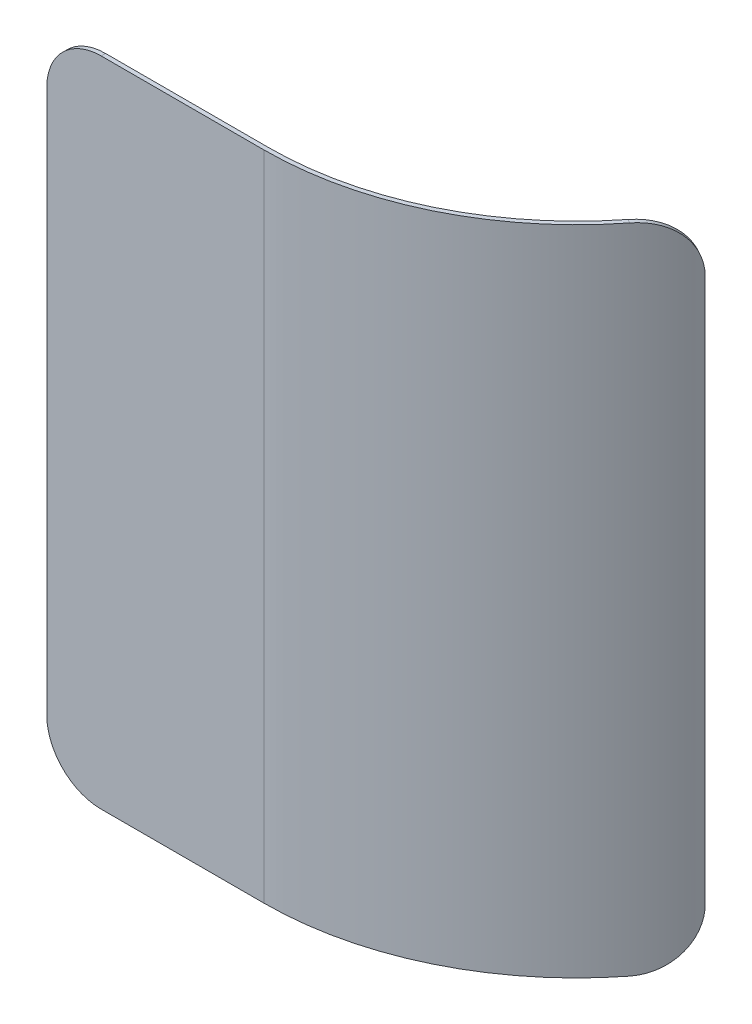
ISO-10303-21;
HEADER;
FILE_DESCRIPTION(('STEP AP214'),'2;1');
FILE_NAME('part.step','',(''),(''),'','','');
FILE_SCHEMA(('AUTOMOTIVE_DESIGN { 1 0 10303 214 1 1 1 1 }'));
ENDSEC;
DATA;
#1=APPLICATION_CONTEXT('core data for automotive mechanical design processes');
#2=APPLICATION_PROTOCOL_DEFINITION('international standard','automotive_design',2000,#1);
#3=PRODUCT_CONTEXT('',#1,'mechanical');
#4=PRODUCT('Part','Part','',(#3));
#5=PRODUCT_RELATED_PRODUCT_CATEGORY('part','',(#4));
#6=PRODUCT_DEFINITION_FORMATION('','',#4);
#7=PRODUCT_DEFINITION_CONTEXT('part definition',#1,'design');
#8=PRODUCT_DEFINITION('design','',#6,#7);
#9=PRODUCT_DEFINITION_SHAPE('','',#8);
#10=(LENGTH_UNIT() NAMED_UNIT(*) SI_UNIT(.MILLI.,.METRE.));
#11=(NAMED_UNIT(*) PLANE_ANGLE_UNIT() SI_UNIT($,.RADIAN.));
#12=(NAMED_UNIT(*) SI_UNIT($,.STERADIAN.) SOLID_ANGLE_UNIT());
#13=UNCERTAINTY_MEASURE_WITH_UNIT(LENGTH_MEASURE(1.E-05),#10,'distance_accuracy_value','');
#14=(GEOMETRIC_REPRESENTATION_CONTEXT(3) GLOBAL_UNCERTAINTY_ASSIGNED_CONTEXT((#13)) GLOBAL_UNIT_ASSIGNED_CONTEXT((#10,
#11,#12)) REPRESENTATION_CONTEXT('',''));
#15=CARTESIAN_POINT('',(0.,0.,0.));
#16=DIRECTION('',(0.,0.,1.));
#17=DIRECTION('',(1.,0.,0.));
#18=AXIS2_PLACEMENT_3D('',#15,#16,#17);
#19=CARTESIAN_POINT('',(50.8,152.4,-71.9582));
#20=DIRECTION('',(0.,-1.,0.));
#21=DIRECTION('',(0.,0.,-1.));
#22=AXIS2_PLACEMENT_3D('',#19,#20,#21);
#23=CYLINDRICAL_SURFACE('',#22,72.9742);
#24=CARTESIAN_POINT('',(50.8,0.,-71.9582));
#25=DIRECTION('',(0.,1.,0.));
#26=DIRECTION('',(1.,0.,0.));
#27=AXIS2_PLACEMENT_3D('',#24,#25,#26);
#28=CIRCLE('',#27,72.9742);
#29=CARTESIAN_POINT('',(50.8,0.,1.016));
#30=VERTEX_POINT('',#29);
#31=CARTESIAN_POINT('',(108.233107341025,0.,-26.9396255357376));
#32=VERTEX_POINT('',#31);
#33=EDGE_CURVE('E146',#30,#32,#28,.T.);
#34=ORIENTED_EDGE('',*,*,#33,.T.);
#35=CARTESIAN_POINT('',(108.233107341025,0.,-26.9396255357376));
#36=CARTESIAN_POINT('',(108.453169759597,-3.95875631742819E-05,-27.2203318838978));
#37=CARTESIAN_POINT('',(108.671142066505,0.0145697167028511,-27.5026923929409));
#38=CARTESIAN_POINT('',(109.101514288191,0.0730377901516772,-28.0686490131688));
#39=CARTESIAN_POINT('',(109.313913928218,0.116897998704514,-28.3522451844756));
#40=CARTESIAN_POINT('',(109.731615060299,0.23378831130764,-28.9184210318365));
#41=CARTESIAN_POINT('',(109.936920285346,0.30680281273591,-29.201001170157));
#42=CARTESIAN_POINT('',(110.339278239954,0.481653975923577,-29.763086523747));
#43=CARTESIAN_POINT('',(110.536331325616,0.583489392507133,-30.0425918713176));
#44=CARTESIAN_POINT('',(110.921238852588,0.815528483083022,-30.5965703400363));
#45=CARTESIAN_POINT('',(111.109083984098,0.945760171245922,-30.8710381995055));
#46=CARTESIAN_POINT('',(111.474353462717,1.23371344440364,-31.4123823980533));
#47=CARTESIAN_POINT('',(111.651777850124,1.39143492308311,-31.6792587664869));
#48=CARTESIAN_POINT('',(111.995280233168,1.73325989000364,-32.2030792613));
#49=CARTESIAN_POINT('',(112.161361870878,1.91735485053993,-32.4600265642142));
#50=CARTESIAN_POINT('',(112.48151115482,2.31068958298728,-32.9618713344081));
#51=CARTESIAN_POINT('',(112.635578954513,2.51992903362033,-33.2067689555935));
#52=CARTESIAN_POINT('',(112.929945244663,2.96033450437034,-33.6805178656449));
#53=CARTESIAN_POINT('',(113.070342581162,3.19131494925111,-33.9094802968036));
#54=CARTESIAN_POINT('',(113.338273330667,3.6749516889415,-34.3514846259011));
#55=CARTESIAN_POINT('',(113.465806740467,3.92760798915302,-34.5645265198723));
#56=CARTESIAN_POINT('',(113.707690811347,4.4528818789554,-34.9728967779243));
#57=CARTESIAN_POINT('',(113.822038113978,4.7255045251132,-35.1682206265979));
#58=CARTESIAN_POINT('',(114.037254804848,5.28872802436848,-35.5393929184948));
#59=CARTESIAN_POINT('',(114.138124322406,5.57932870492994,-35.7152415485774));
#60=CARTESIAN_POINT('',(114.326535354242,6.17750978729588,-36.0465079550277));
#61=CARTESIAN_POINT('',(114.414029093693,6.48514594233968,-36.201852237248));
#62=CARTESIAN_POINT('',(114.575143707308,7.11428807054829,-36.4900146602961));
#63=CARTESIAN_POINT('',(114.648764402979,7.43579422210217,-36.6228325112916));
#64=CARTESIAN_POINT('',(114.782029940982,8.09028722573862,-36.8647134590453));
#65=CARTESIAN_POINT('',(114.841680555302,8.4232692708858,-36.9737863651332));
#66=CARTESIAN_POINT('',(114.946986202533,9.09834933981883,-37.1672513825819));
#67=CARTESIAN_POINT('',(114.992644248992,9.44044538346856,-37.2516488080647));
#68=CARTESIAN_POINT('',(115.084699178187,10.2632807429788,-37.422359361239));
#69=CARTESIAN_POINT('',(115.124758535671,10.7472154722341,-37.4971671818313));
#70=CARTESIAN_POINT('',(115.164772964845,11.4773956666169,-37.5720032268193));
#71=CARTESIAN_POINT('',(115.174765352432,11.7213823527958,-37.5907192628038));
#72=CARTESIAN_POINT('',(115.188089502668,12.2102234694188,-37.6156911279975));
#73=CARTESIAN_POINT('',(115.191419918982,12.4550780652469,-37.6219444385843));
#74=CARTESIAN_POINT('',(115.191424135602,12.7,-37.6219456406636));
#75=B_SPLINE_CURVE_WITH_KNOTS('',3,(#35,#36,#37,#38,#39,#40,#41,#42,#43,#44,#45,#46,#47,#48,#49,
#50,#51,#52,#53,#54,#55,#56,#57,#58,#59,#60,#61,#62,#63,#64,#65,#66,#67,#68,#69,#70,#71,#72,#73,
#74),.UNSPECIFIED.,.F.,.F.,(4,2,2,2,2,2,2,2,2,2,2,2,2,2,2,2,2,2,2,4),(0.,1.06976160584045,
2.13957585608495,3.20881833519534,4.27801462591431,5.34827053715569,6.41852230932959,
7.48842879992278,8.55832162148128,9.6197921173392,10.6812628777306,11.7430033961913,
12.8047337266604,13.8701718790906,14.9356237387498,16.0006346083193,17.0654159474623,
18.5356054122993,19.2699859955488,20.0045149765091),.UNSPECIFIED.);
#76=CARTESIAN_POINT('',(115.191424135602,12.7,-37.6219456406636));
#77=VERTEX_POINT('',#76);
#78=EDGE_CURVE('E190',#32,#77,#75,.T.);
#79=ORIENTED_EDGE('',*,*,#78,.T.);
#80=DIRECTION('',(0.,-1.,0.));
#81=VECTOR('',#80,1.);
#82=CARTESIAN_POINT('',(115.191424135602,152.4,-37.6219456406636));
#83=LINE('',#82,#81);
#84=CARTESIAN_POINT('',(115.191424135602,139.7,-37.6219456406636));
#85=VERTEX_POINT('',#84);
#86=EDGE_CURVE('E161',#85,#77,#83,.T.);
#87=ORIENTED_EDGE('',*,*,#86,.F.);
#88=CARTESIAN_POINT('',(115.191424135602,139.7,-37.6219456406636));
#89=CARTESIAN_POINT('',(115.191424772239,140.057093889125,-37.6219887781376));
#90=CARTESIAN_POINT('',(115.184337778062,140.414182276718,-37.6086577782013));
#91=CARTESIAN_POINT('',(115.155993029288,141.12580613468,-37.5555590827894));
#92=CARTESIAN_POINT('',(115.134735936347,141.480341723467,-37.5157926216876));
#93=CARTESIAN_POINT('',(115.078075413901,142.184104425506,-37.4101716683627));
#94=CARTESIAN_POINT('',(115.042681939858,142.533335095431,-37.3443355358289));
#95=CARTESIAN_POINT('',(114.957761569478,143.22425942651,-37.1871844887364));
#96=CARTESIAN_POINT('',(114.908234845996,143.565953179789,-37.0958698857888));
#97=CARTESIAN_POINT('',(114.795045874634,144.23955056805,-36.8885279181646));
#98=CARTESIAN_POINT('',(114.731376483929,144.571449159636,-36.772488067086));
#99=CARTESIAN_POINT('',(114.58996777691,145.222911844635,-36.5167664235994));
#100=CARTESIAN_POINT('',(114.512228484411,145.542475958923,-36.3770846712074));
#101=CARTESIAN_POINT('',(114.342781341037,146.166939624257,-36.0753528239628));
#102=CARTESIAN_POINT('',(114.251075786002,146.471841574718,-35.9133064059298));
#103=CARTESIAN_POINT('',(114.053825615632,147.064856195397,-35.5682716962739));
#104=CARTESIAN_POINT('',(113.948281094115,147.352968979412,-35.385283546621));
#105=CARTESIAN_POINT('',(113.723700455362,147.909989491082,-35.0002322558067));
#106=CARTESIAN_POINT('',(113.604681642185,148.178921143789,-34.7981936343159));
#107=CARTESIAN_POINT('',(113.353331332349,148.696058774559,-34.3766245946388));
#108=CARTESIAN_POINT('',(113.220999780899,148.944264667315,-34.1570941044631));
#109=CARTESIAN_POINT('',(112.94340102046,149.418194824555,-33.7024487715776));
#110=CARTESIAN_POINT('',(112.798132758812,149.64391725639,-33.4673326610657));
#111=CARTESIAN_POINT('',(112.49517619262,150.071249311005,-32.9835861023984));
#112=CARTESIAN_POINT('',(112.337488121573,150.272859386929,-32.7349559083412));
#113=CARTESIAN_POINT('',(112.011159926929,150.649588965819,-32.2276293172417));
#114=CARTESIAN_POINT('',(111.842580030043,150.824838851398,-31.9689909954213));
#115=CARTESIAN_POINT('',(111.494509110154,151.148890731984,-31.4426477153245));
#116=CARTESIAN_POINT('',(111.315017996357,151.297692506876,-31.1749426816119));
#117=CARTESIAN_POINT('',(110.946062467839,151.56784242961,-30.6327542241648));
#118=CARTESIAN_POINT('',(110.756600864727,151.689198266422,-30.3582727228157));
#119=CARTESIAN_POINT('',(110.368776240245,151.903747029049,-29.8048008332721));
#120=CARTESIAN_POINT('',(110.170415155616,151.996946048647,-29.5258114344796));
#121=CARTESIAN_POINT('',(109.691115589984,152.183843736351,-28.8618697276416));
#122=CARTESIAN_POINT('',(109.406707694697,152.265044621365,-28.4757929948779));
#123=CARTESIAN_POINT('',(108.972019604202,152.346090954016,-27.8979199561549));
#124=CARTESIAN_POINT('',(108.825869689256,152.36631396329,-27.7056202440967));
#125=CARTESIAN_POINT('',(108.531180144651,152.393268178073,-27.3218553821782));
#126=CARTESIAN_POINT('',(108.38264011356,152.399997092823,-27.1303903795224));
#127=CARTESIAN_POINT('',(108.233107341025,152.4,-26.9396255357376));
#128=B_SPLINE_CURVE_WITH_KNOTS('',3,(#88,#89,#90,#91,#92,#93,#94,#95,#96,#97,#98,#99,#100,#101,
#102,#103,#104,#105,#106,#107,#108,#109,#110,#111,#112,#113,#114,#115,#116,#117,#118,#119,#120,
#121,#122,#123,#124,#125,#126,#127),.UNSPECIFIED.,.F.,.F.,(4,2,2,2,2,2,2,2,2,2,2,2,2,2,2,2,2,2,
2,4),(0.,1.07095489029427,2.14185977708419,3.21201181157579,4.28215075828529,5.35283141803801,
6.42351026558771,7.49401329946163,8.56450907651355,9.63364536283926,10.7027860495244,
11.7720138117424,12.8412214767912,13.9049532242588,14.9686938242975,16.032136047588,
17.0953479523486,18.550761733781,19.2775771530068,20.0045159461018),.UNSPECIFIED.);
#129=CARTESIAN_POINT('',(108.233107341025,152.4,-26.9396255357376));
#130=VERTEX_POINT('',#129);
#131=EDGE_CURVE('E184',#85,#130,#128,.T.);
#132=ORIENTED_EDGE('',*,*,#131,.T.);
#133=CARTESIAN_POINT('',(50.8,152.4,-71.9582));
#134=DIRECTION('',(0.,1.,0.));
#135=DIRECTION('',(1.,0.,0.));
#136=AXIS2_PLACEMENT_3D('',#133,#134,#135);
#137=CIRCLE('',#136,72.9742);
#138=CARTESIAN_POINT('',(50.8,152.4,1.016));
#139=VERTEX_POINT('',#138);
#140=EDGE_CURVE('E139',#139,#130,#137,.T.);
#141=ORIENTED_EDGE('',*,*,#140,.F.);
#142=DIRECTION('',(0.,-1.,0.));
#143=VECTOR('',#142,1.);
#144=CARTESIAN_POINT('',(50.8,152.4,1.016));
#145=LINE('',#144,#143);
#146=EDGE_CURVE('E145',#139,#30,#145,.T.);
#147=ORIENTED_EDGE('',*,*,#146,.T.);
#148=EDGE_LOOP('',(#34,#79,#87,#132,#141,#147));
#149=FACE_BOUND('',#148,.T.);
#150=ADVANCED_FACE('F33',(#149),#23,.T.);
#151=CARTESIAN_POINT('',(114.294919796784,152.4,-38.1));
#152=DIRECTION('',(0.470525944228745,0.,-0.882386160253915));
#153=DIRECTION('',(-0.882386160253915,0.,-0.470525944228745));
#154=AXIS2_PLACEMENT_3D('',#151,#152,#153);
#155=PLANE('',#154);
#156=ORIENTED_EDGE('',*,*,#86,.T.);
#157=DIRECTION('',(0.882386160253915,0.,0.470525944228745));
#158=VECTOR('',#157,1.);
#159=CARTESIAN_POINT('',(114.294919796784,12.7,-38.1));
#160=LINE('',#159,#158);
#161=CARTESIAN_POINT('',(114.294919796784,12.7,-38.1));
#162=VERTEX_POINT('',#161);
#163=EDGE_CURVE('E53',#77,#162,#160,.F.);
#164=ORIENTED_EDGE('',*,*,#163,.T.);
#165=DIRECTION('',(0.,-1.,0.));
#166=VECTOR('',#165,1.);
#167=CARTESIAN_POINT('',(114.294919796784,152.4,-38.1));
#168=LINE('',#167,#166);
#169=CARTESIAN_POINT('',(114.294919796784,139.7,-38.1));
#170=VERTEX_POINT('',#169);
#171=EDGE_CURVE('E132',#170,#162,#168,.T.);
#172=ORIENTED_EDGE('',*,*,#171,.F.);
#173=DIRECTION('',(0.882386160253915,0.,0.470525944228745));
#174=VECTOR('',#173,1.);
#175=CARTESIAN_POINT('',(114.294919796784,139.7,-38.1));
#176=LINE('',#175,#174);
#177=EDGE_CURVE('E240',#170,#85,#176,.T.);
#178=ORIENTED_EDGE('',*,*,#177,.T.);
#179=EDGE_LOOP('',(#156,#164,#172,#178));
#180=FACE_BOUND('',#179,.T.);
#181=ADVANCED_FACE('F199',(#180),#155,.T.);
#182=CARTESIAN_POINT('',(50.8,152.4,-71.9582));
#183=DIRECTION('',(0.,-1.,0.));
#184=DIRECTION('',(0.,0.,-1.));
#185=AXIS2_PLACEMENT_3D('',#182,#183,#184);
#186=CYLINDRICAL_SURFACE('',#185,71.9582);
#187=ORIENTED_EDGE('',*,*,#171,.T.);
#188=CARTESIAN_POINT('',(114.294919796784,12.7,-38.1));
#189=CARTESIAN_POINT('',(114.294920187521,12.3429091558952,-38.1000432671134));
#190=CARTESIAN_POINT('',(114.287833552361,11.9858238128965,-38.0867123682238));
#191=CARTESIAN_POINT('',(114.259488953809,11.2742059664593,-38.0336147537666));
#192=CARTESIAN_POINT('',(114.238231651586,10.9196733446971,-37.9938492715729));
#193=CARTESIAN_POINT('',(114.181568323897,10.2159159188054,-37.8882320102927));
#194=CARTESIAN_POINT('',(114.146172234305,9.86668756567965,-37.8223985504668));
#195=CARTESIAN_POINT('',(114.061240818049,9.17576771861875,-37.6652563990039));
#196=CARTESIAN_POINT('',(114.011705664321,8.83407613255631,-37.5739480189515));
#197=CARTESIAN_POINT('',(113.898489480595,8.16048273383067,-37.3666243934827));
#198=CARTESIAN_POINT('',(113.834801294359,7.82858597026572,-37.2505966503734));
#199=CARTESIAN_POINT('',(113.693339146874,7.17712692393352,-36.9949081780948));
#200=CARTESIAN_POINT('',(113.615565211395,6.8575646186016,-36.8552474921623));
#201=CARTESIAN_POINT('',(113.446026636745,6.2331045979696,-36.5535702212698));
#202=CARTESIAN_POINT('',(113.354264292811,5.92820448765519,-36.391557304305));
#203=CARTESIAN_POINT('',(113.156871669285,5.33519400472444,-36.0466061364312));
#204=CARTESIAN_POINT('',(113.051241484263,5.04708351763544,-35.8636680282166));
#205=CARTESIAN_POINT('',(112.826457893722,4.49007844571884,-35.4787447145723));
#206=CARTESIAN_POINT('',(112.707322325692,4.22115926169094,-35.276784691013));
#207=CARTESIAN_POINT('',(112.455697079381,3.7040463655656,-34.8554000291403));
#208=CARTESIAN_POINT('',(112.323207346596,3.45585273806418,-34.6359753195479));
#209=CARTESIAN_POINT('',(112.045245073773,2.98194789016956,-34.1815746274543));
#210=CARTESIAN_POINT('',(111.899771520842,2.75623842672199,-33.9465974320432));
#211=CARTESIAN_POINT('',(111.596351544319,2.32893204104285,-33.4631664463393));
#212=CARTESIAN_POINT('',(111.438405356455,2.12733466328455,-33.2147129107711));
#213=CARTESIAN_POINT('',(111.111533465446,1.75066184029125,-32.7078252107724));
#214=CARTESIAN_POINT('',(110.942670295806,1.57545167408101,-32.4494508284014));
#215=CARTESIAN_POINT('',(110.593969865219,1.25146077682797,-31.9236745605719));
#216=CARTESIAN_POINT('',(110.414132046838,1.10268138978061,-31.6562722168672));
#217=CARTESIAN_POINT('',(110.04442785896,0.832566450858849,-31.114746361113));
#218=CARTESIAN_POINT('',(109.854564477337,0.711222778748387,-30.8406248644469));
#219=CARTESIAN_POINT('',(109.465878047488,0.496681873371202,-30.2879281973359));
#220=CARTESIAN_POINT('',(109.267056942684,0.403478568381806,-30.0093540013083));
#221=CARTESIAN_POINT('',(108.786273807543,0.216419773868907,-29.346014690535));
#222=CARTESIAN_POINT('',(108.500799252649,0.135115588410234,-28.9601441745919));
#223=CARTESIAN_POINT('',(108.064418394771,0.0539704704062548,-28.3826641555148));
#224=CARTESIAN_POINT('',(107.917689304692,0.0337238907779265,-28.1905094874496));
#225=CARTESIAN_POINT('',(107.621812266881,0.00673898099368487,-27.8070633445955));
#226=CARTESIAN_POINT('',(107.472663915984,2.92614513557131E-06,-27.6157720206137));
#227=CARTESIAN_POINT('',(107.322509165148,0.,-27.4251953302525));
#228=B_SPLINE_CURVE_WITH_KNOTS('',3,(#188,#189,#190,#191,#192,#193,#194,#195,#196,#197,#198,
#199,#200,#201,#202,#203,#204,#205,#206,#207,#208,#209,#210,#211,#212,#213,#214,#215,#216,#217,
#218,#219,#220,#221,#222,#223,#224,#225,#226,#227),.UNSPECIFIED.,.F.,.F.,(4,2,2,2,2,2,2,2,2,2,2,
2,2,2,2,2,2,2,2,4),(0.,1.07094576404323,2.14184156384826,3.21198612391585,4.28211759558143,
5.3527913970895,6.42346323981299,7.49395959408999,8.56444864880469,9.63353995537408,
10.702635625467,11.7718147708427,12.8409737140408,13.9044741115231,14.9680285721418,
16.0312678358847,17.0942775249749,18.5511151716778,19.2786401127119,20.0062875659309),.UNSPECIFIED.);
#229=CARTESIAN_POINT('',(107.322509165148,0.,-27.4251953302525));
#230=VERTEX_POINT('',#229);
#231=EDGE_CURVE('E11',#162,#230,#228,.T.);
#232=ORIENTED_EDGE('',*,*,#231,.T.);
#233=CARTESIAN_POINT('',(50.8,0.,-71.9582));
#234=DIRECTION('',(0.,1.,0.));
#235=DIRECTION('',(0.,0.,1.));
#236=AXIS2_PLACEMENT_3D('',#233,#234,#235);
#237=CIRCLE('',#236,71.9582);
#238=CARTESIAN_POINT('',(50.8,0.,0.));
#239=VERTEX_POINT('',#238);
#240=EDGE_CURVE('E131',#239,#230,#237,.T.);
#241=ORIENTED_EDGE('',*,*,#240,.F.);
#242=DIRECTION('',(0.,-1.,0.));
#243=VECTOR('',#242,1.);
#244=CARTESIAN_POINT('',(50.8,152.4,0.));
#245=LINE('',#244,#243);
#246=CARTESIAN_POINT('',(50.8,152.4,0.));
#247=VERTEX_POINT('',#246);
#248=EDGE_CURVE('E119',#247,#239,#245,.T.);
#249=ORIENTED_EDGE('',*,*,#248,.F.);
#250=CARTESIAN_POINT('',(50.8,152.4,-71.9582));
#251=DIRECTION('',(0.,1.,0.));
#252=DIRECTION('',(0.,0.,1.));
#253=AXIS2_PLACEMENT_3D('',#250,#251,#252);
#254=CIRCLE('',#253,71.9582);
#255=CARTESIAN_POINT('',(107.322509165148,152.4,-27.4251953302525));
#256=VERTEX_POINT('',#255);
#257=EDGE_CURVE('E127',#247,#256,#254,.T.);
#258=ORIENTED_EDGE('',*,*,#257,.T.);
#259=CARTESIAN_POINT('',(107.322509165148,152.4,-27.4251953302525));
#260=CARTESIAN_POINT('',(107.543262762416,152.400039614938,-27.7053399146062));
#261=CARTESIAN_POINT('',(107.761901331591,152.385444412754,-27.9871673836646));
#262=CARTESIAN_POINT('',(108.193553871464,152.327026286918,-28.5521185980696));
#263=CARTESIAN_POINT('',(108.406567549585,152.283201846017,-28.8352424099499));
#264=CARTESIAN_POINT('',(108.825441934561,152.166398006581,-29.4005380114797));
#265=CARTESIAN_POINT('',(109.031306359022,152.093434015017,-29.6827102248876));
#266=CARTESIAN_POINT('',(109.434724423152,151.9186932548,-30.2440413761041));
#267=CARTESIAN_POINT('',(109.632278428573,151.816917755706,-30.5232004461221));
#268=CARTESIAN_POINT('',(110.018131710136,151.585001583327,-31.0765496268037));
#269=CARTESIAN_POINT('',(110.206421484079,151.45483250099,-31.3507344607532));
#270=CARTESIAN_POINT('',(110.572520585536,151.167004761433,-31.8915683572262));
#271=CARTESIAN_POINT('',(110.750329954851,151.009346213869,-32.1582174498044));
#272=CARTESIAN_POINT('',(111.09454326441,150.667645685803,-32.6816332233407));
#273=CARTESIAN_POINT('',(111.260950913894,150.483612346443,-32.9384031061983));
#274=CARTESIAN_POINT('',(111.581697041413,150.09039748346,-33.4399384595928));
#275=CARTESIAN_POINT('',(111.736035676112,149.881216286369,-33.6847040859397));
#276=CARTESIAN_POINT('',(112.030858062269,149.440971637625,-34.158177078232));
#277=CARTESIAN_POINT('',(112.171443832906,149.210098980332,-34.3869983726408));
#278=CARTESIAN_POINT('',(112.439712386291,148.726682834288,-34.8287615057544));
#279=CARTESIAN_POINT('',(112.56739516769,148.474139343271,-35.0417033427985));
#280=CARTESIAN_POINT('',(112.809545346752,147.949094492449,-35.4499107470819));
#281=CARTESIAN_POINT('',(112.924009357783,147.676588047258,-35.6451717817684));
#282=CARTESIAN_POINT('',(113.139433172202,147.113599390059,-36.0162514861935));
#283=CARTESIAN_POINT('',(113.240393103,146.823117347688,-36.1920703393664));
#284=CARTESIAN_POINT('',(113.42897394222,146.225148561519,-36.5233211252008));
#285=CARTESIAN_POINT('',(113.516545790539,145.9176046506,-36.6786778001433));
#286=CARTESIAN_POINT('',(113.677800853105,145.288644255124,-36.9668869967502));
#287=CARTESIAN_POINT('',(113.75148388667,144.967227590162,-37.0997392256491));
#288=CARTESIAN_POINT('',(113.884864333826,144.312909072566,-37.3417076172491));
#289=CARTESIAN_POINT('',(113.944567500894,143.980012009686,-37.4508335432896));
#290=CARTESIAN_POINT('',(114.04997346988,143.305096744067,-37.644419984306));
#291=CARTESIAN_POINT('',(114.095679276381,142.963080515948,-37.7288857924794));
#292=CARTESIAN_POINT('',(114.187922546489,142.139754882538,-37.8999137968078));
#293=CARTESIAN_POINT('',(114.228084681346,141.655227868426,-37.9749082770272));
#294=CARTESIAN_POINT('',(114.268201180097,140.924141466747,-38.0499318159391));
#295=CARTESIAN_POINT('',(114.278218908432,140.679849254816,-38.0686949337954));
#296=CARTESIAN_POINT('',(114.29157674988,140.190394017185,-38.093729688974));
#297=CARTESIAN_POINT('',(114.294915515689,139.945230825778,-38.0999988059607));
#298=CARTESIAN_POINT('',(114.294919796784,139.7,-38.1));
#299=B_SPLINE_CURVE_WITH_KNOTS('',3,(#259,#260,#261,#262,#263,#264,#265,#266,#267,#268,#269,
#270,#271,#272,#273,#274,#275,#276,#277,#278,#279,#280,#281,#282,#283,#284,#285,#286,#287,#288,
#289,#290,#291,#292,#293,#294,#295,#296,#297,#298),.UNSPECIFIED.,.F.,.F.,(4,2,2,2,2,2,2,2,2,2,2,
2,2,2,2,2,2,2,2,4),(0.,1.06971893764533,2.13949340724581,3.20870300165983,4.27786548945213,
5.34810266966203,6.41833558085205,7.48821865117481,8.55808783121327,9.61929853430191,
10.6805093483694,11.7419914429135,12.803463521665,13.868736610944,14.9340235575355,
15.9988713069259,17.0634903225969,18.5355254424069,19.2708318057827,20.0062864828454),.UNSPECIFIED.);
#300=EDGE_CURVE('E46',#256,#170,#299,.T.);
#301=ORIENTED_EDGE('',*,*,#300,.T.);
#302=EDGE_LOOP('',(#187,#232,#241,#249,#258,#301));
#303=FACE_BOUND('',#302,.T.);
#304=ADVANCED_FACE('F129',(#303),#186,.F.);
#305=CARTESIAN_POINT('',(0.,152.4,0.));
#306=DIRECTION('',(0.,0.,-1.));
#307=DIRECTION('',(-1.,0.,0.));
#308=AXIS2_PLACEMENT_3D('',#305,#306,#307);
#309=PLANE('',#308);
#310=DIRECTION('',(1.,0.,0.));
#311=VECTOR('',#310,1.);
#312=CARTESIAN_POINT('',(0.,0.,0.));
#313=LINE('',#312,#311);
#314=CARTESIAN_POINT('',(12.7,0.,0.));
#315=VERTEX_POINT('',#314);
#316=EDGE_CURVE('E150',#315,#239,#313,.T.);
#317=ORIENTED_EDGE('',*,*,#316,.F.);
#318=CARTESIAN_POINT('',(12.7,12.7,0.));
#319=DIRECTION('',(0.,0.,-1.));
#320=DIRECTION('',(-1.,0.,0.));
#321=AXIS2_PLACEMENT_3D('',#318,#319,#320);
#322=CIRCLE('',#321,12.7);
#323=CARTESIAN_POINT('',(0.,12.7,0.));
#324=VERTEX_POINT('',#323);
#325=EDGE_CURVE('E170',#315,#324,#322,.T.);
#326=ORIENTED_EDGE('',*,*,#325,.T.);
#327=DIRECTION('',(0.,-1.,0.));
#328=VECTOR('',#327,1.);
#329=CARTESIAN_POINT('',(0.,152.4,0.));
#330=LINE('',#329,#328);
#331=CARTESIAN_POINT('',(0.,139.7,0.));
#332=VERTEX_POINT('',#331);
#333=EDGE_CURVE('E133',#332,#324,#330,.T.);
#334=ORIENTED_EDGE('',*,*,#333,.F.);
#335=CARTESIAN_POINT('',(12.7,139.7,0.));
#336=DIRECTION('',(0.,0.,-1.));
#337=DIRECTION('',(-1.,0.,0.));
#338=AXIS2_PLACEMENT_3D('',#335,#336,#337);
#339=CIRCLE('',#338,12.7);
#340=CARTESIAN_POINT('',(12.7,152.4,0.));
#341=VERTEX_POINT('',#340);
#342=EDGE_CURVE('E122',#332,#341,#339,.T.);
#343=ORIENTED_EDGE('',*,*,#342,.T.);
#344=DIRECTION('',(1.,0.,0.));
#345=VECTOR('',#344,1.);
#346=CARTESIAN_POINT('',(0.,152.4,0.));
#347=LINE('',#346,#345);
#348=EDGE_CURVE('E115',#341,#247,#347,.T.);
#349=ORIENTED_EDGE('',*,*,#348,.T.);
#350=ORIENTED_EDGE('',*,*,#248,.T.);
#351=EDGE_LOOP('',(#317,#326,#334,#343,#349,#350));
#352=FACE_BOUND('',#351,.T.);
#353=ADVANCED_FACE('F118',(#352),#309,.T.);
#354=CARTESIAN_POINT('',(0.,152.4,1.016));
#355=DIRECTION('',(-1.,0.,0.));
#356=DIRECTION('',(0.,0.,1.));
#357=AXIS2_PLACEMENT_3D('',#354,#355,#356);
#358=PLANE('',#357);
#359=ORIENTED_EDGE('',*,*,#333,.T.);
#360=DIRECTION('',(0.,0.,-1.));
#361=VECTOR('',#360,1.);
#362=CARTESIAN_POINT('',(0.,12.7,1.016));
#363=LINE('',#362,#361);
#364=CARTESIAN_POINT('',(0.,12.7,1.016));
#365=VERTEX_POINT('',#364);
#366=EDGE_CURVE('E175',#324,#365,#363,.F.);
#367=ORIENTED_EDGE('',*,*,#366,.T.);
#368=DIRECTION('',(0.,-1.,0.));
#369=VECTOR('',#368,1.);
#370=CARTESIAN_POINT('',(0.,152.4,1.016));
#371=LINE('',#370,#369);
#372=CARTESIAN_POINT('',(0.,139.7,1.016));
#373=VERTEX_POINT('',#372);
#374=EDGE_CURVE('E155',#373,#365,#371,.T.);
#375=ORIENTED_EDGE('',*,*,#374,.F.);
#376=DIRECTION('',(0.,0.,-1.));
#377=VECTOR('',#376,1.);
#378=CARTESIAN_POINT('',(0.,139.7,1.016));
#379=LINE('',#378,#377);
#380=EDGE_CURVE('E172',#373,#332,#379,.T.);
#381=ORIENTED_EDGE('',*,*,#380,.T.);
#382=EDGE_LOOP('',(#359,#367,#375,#381));
#383=FACE_BOUND('',#382,.T.);
#384=ADVANCED_FACE('F227',(#383),#358,.T.);
#385=CARTESIAN_POINT('',(0.,152.4,1.016));
#386=DIRECTION('',(0.,0.,-1.));
#387=DIRECTION('',(-1.,0.,0.));
#388=AXIS2_PLACEMENT_3D('',#385,#386,#387);
#389=PLANE('',#388);
#390=ORIENTED_EDGE('',*,*,#374,.T.);
#391=CARTESIAN_POINT('',(12.7,12.7,1.016));
#392=DIRECTION('',(0.,0.,-1.));
#393=DIRECTION('',(-1.,0.,0.));
#394=AXIS2_PLACEMENT_3D('',#391,#392,#393);
#395=CIRCLE('',#394,12.7);
#396=CARTESIAN_POINT('',(12.7,0.,1.016));
#397=VERTEX_POINT('',#396);
#398=EDGE_CURVE('E179',#365,#397,#395,.F.);
#399=ORIENTED_EDGE('',*,*,#398,.T.);
#400=DIRECTION('',(1.,0.,0.));
#401=VECTOR('',#400,1.);
#402=CARTESIAN_POINT('',(0.,0.,1.016));
#403=LINE('',#402,#401);
#404=EDGE_CURVE('E141',#397,#30,#403,.T.);
#405=ORIENTED_EDGE('',*,*,#404,.T.);
#406=ORIENTED_EDGE('',*,*,#146,.F.);
#407=DIRECTION('',(1.,0.,0.));
#408=VECTOR('',#407,1.);
#409=CARTESIAN_POINT('',(0.,152.4,1.016));
#410=LINE('',#409,#408);
#411=CARTESIAN_POINT('',(12.7,152.4,1.016));
#412=VERTEX_POINT('',#411);
#413=EDGE_CURVE('E126',#412,#139,#410,.T.);
#414=ORIENTED_EDGE('',*,*,#413,.F.);
#415=CARTESIAN_POINT('',(12.7,139.7,1.016));
#416=DIRECTION('',(0.,0.,-1.));
#417=DIRECTION('',(-1.,0.,0.));
#418=AXIS2_PLACEMENT_3D('',#415,#416,#417);
#419=CIRCLE('',#418,12.7);
#420=EDGE_CURVE('E177',#412,#373,#419,.F.);
#421=ORIENTED_EDGE('',*,*,#420,.T.);
#422=EDGE_LOOP('',(#390,#399,#405,#406,#414,#421));
#423=FACE_BOUND('',#422,.T.);
#424=ADVANCED_FACE('F232',(#423),#389,.F.);
#425=CARTESIAN_POINT('',(50.8,152.4,-71.9582));
#426=DIRECTION('',(0.,1.,0.));
#427=DIRECTION('',(0.,0.,1.));
#428=AXIS2_PLACEMENT_3D('',#425,#426,#427);
#429=PLANE('',#428);
#430=ORIENTED_EDGE('',*,*,#348,.F.);
#431=DIRECTION('',(0.,0.,-1.));
#432=VECTOR('',#431,1.);
#433=CARTESIAN_POINT('',(12.7,152.4,-71.9582));
#434=LINE('',#433,#432);
#435=EDGE_CURVE('E182',#341,#412,#434,.F.);
#436=ORIENTED_EDGE('',*,*,#435,.T.);
#437=ORIENTED_EDGE('',*,*,#413,.T.);
#438=ORIENTED_EDGE('',*,*,#140,.T.);
#439=DIRECTION('',(0.882386160253915,0.,0.470525944228745));
#440=VECTOR('',#439,1.);
#441=CARTESIAN_POINT('',(44.8243205082954,152.4,-60.7518957647762));
#442=LINE('',#441,#440);
#443=EDGE_CURVE('E138',#130,#256,#442,.F.);
#444=ORIENTED_EDGE('',*,*,#443,.T.);
#445=ORIENTED_EDGE('',*,*,#257,.F.);
#446=EDGE_LOOP('',(#430,#436,#437,#438,#444,#445));
#447=FACE_BOUND('',#446,.T.);
#448=ADVANCED_FACE('F135',(#447),#429,.T.);
#449=CARTESIAN_POINT('',(50.8,0.,-71.9582));
#450=DIRECTION('',(0.,1.,0.));
#451=DIRECTION('',(0.,0.,1.));
#452=AXIS2_PLACEMENT_3D('',#449,#450,#451);
#453=PLANE('',#452);
#454=ORIENTED_EDGE('',*,*,#404,.F.);
#455=DIRECTION('',(0.,0.,-1.));
#456=VECTOR('',#455,1.);
#457=CARTESIAN_POINT('',(12.7,0.,0.));
#458=LINE('',#457,#456);
#459=EDGE_CURVE('E166',#397,#315,#458,.T.);
#460=ORIENTED_EDGE('',*,*,#459,.T.);
#461=ORIENTED_EDGE('',*,*,#316,.T.);
#462=ORIENTED_EDGE('',*,*,#240,.T.);
#463=DIRECTION('',(0.882386160253915,0.,0.470525944228745));
#464=VECTOR('',#463,1.);
#465=CARTESIAN_POINT('',(109.215744643897,0.,-26.4156414054389));
#466=LINE('',#465,#464);
#467=EDGE_CURVE('E163',#230,#32,#466,.T.);
#468=ORIENTED_EDGE('',*,*,#467,.T.);
#469=ORIENTED_EDGE('',*,*,#33,.F.);
#470=EDGE_LOOP('',(#454,#460,#461,#462,#468,#469));
#471=FACE_BOUND('',#470,.T.);
#472=ADVANCED_FACE('F206',(#471),#453,.F.);
#473=CARTESIAN_POINT('',(12.7,12.7,-71.9582));
#474=DIRECTION('',(0.,0.,1.));
#475=DIRECTION('',(1.,0.,0.));
#476=AXIS2_PLACEMENT_3D('',#473,#474,#475);
#477=CYLINDRICAL_SURFACE('',#476,12.7);
#478=ORIENTED_EDGE('',*,*,#398,.F.);
#479=ORIENTED_EDGE('',*,*,#366,.F.);
#480=ORIENTED_EDGE('',*,*,#325,.F.);
#481=ORIENTED_EDGE('',*,*,#459,.F.);
#482=EDGE_LOOP('',(#478,#479,#480,#481));
#483=FACE_BOUND('',#482,.T.);
#484=ADVANCED_FACE('F201',(#483),#477,.T.);
#485=CARTESIAN_POINT('',(12.7,139.7,1.016));
#486=DIRECTION('',(0.,0.,-1.));
#487=DIRECTION('',(-1.,0.,0.));
#488=AXIS2_PLACEMENT_3D('',#485,#486,#487);
#489=CYLINDRICAL_SURFACE('',#488,12.7);
#490=ORIENTED_EDGE('',*,*,#420,.F.);
#491=ORIENTED_EDGE('',*,*,#435,.F.);
#492=ORIENTED_EDGE('',*,*,#342,.F.);
#493=ORIENTED_EDGE('',*,*,#380,.F.);
#494=EDGE_LOOP('',(#490,#491,#492,#493));
#495=FACE_BOUND('',#494,.T.);
#496=ADVANCED_FACE('F205',(#495),#489,.T.);
#497=CARTESIAN_POINT('',(44.8243205082954,12.7,-60.7518957647762));
#498=DIRECTION('',(-0.882386160253915,0.,-0.470525944228745));
#499=DIRECTION('',(-0.470525944228745,0.,0.882386160253915));
#500=AXIS2_PLACEMENT_3D('',#497,#498,#499);
#501=CYLINDRICAL_SURFACE('',#500,12.7);
#502=ORIENTED_EDGE('',*,*,#231,.F.);
#503=ORIENTED_EDGE('',*,*,#163,.F.);
#504=ORIENTED_EDGE('',*,*,#78,.F.);
#505=ORIENTED_EDGE('',*,*,#467,.F.);
#506=EDGE_LOOP('',(#502,#503,#504,#505));
#507=FACE_BOUND('',#506,.T.);
#508=ADVANCED_FACE('F209',(#507),#501,.T.);
#509=CARTESIAN_POINT('',(108.319240305079,139.7,-26.8936957647753));
#510=DIRECTION('',(0.882386160253915,0.,0.470525944228745));
#511=DIRECTION('',(0.470525944228745,0.,-0.882386160253915));
#512=AXIS2_PLACEMENT_3D('',#509,#510,#511);
#513=CYLINDRICAL_SURFACE('',#512,12.7);
#514=ORIENTED_EDGE('',*,*,#300,.F.);
#515=ORIENTED_EDGE('',*,*,#443,.F.);
#516=ORIENTED_EDGE('',*,*,#131,.F.);
#517=ORIENTED_EDGE('',*,*,#177,.F.);
#518=EDGE_LOOP('',(#514,#515,#516,#517));
#519=FACE_BOUND('',#518,.T.);
#520=ADVANCED_FACE('F35',(#519),#513,.T.);
#521=CLOSED_SHELL('',(#150,#181,#304,#353,#384,#424,#448,#472,#484,#496,#508,#520));
#522=MANIFOLD_SOLID_BREP('B2',#521);
#523=ADVANCED_BREP_SHAPE_REPRESENTATION('',(#18,#522),#14);
#524=SHAPE_DEFINITION_REPRESENTATION(#9,#523);
ENDSEC;
END-ISO-10303-21;
